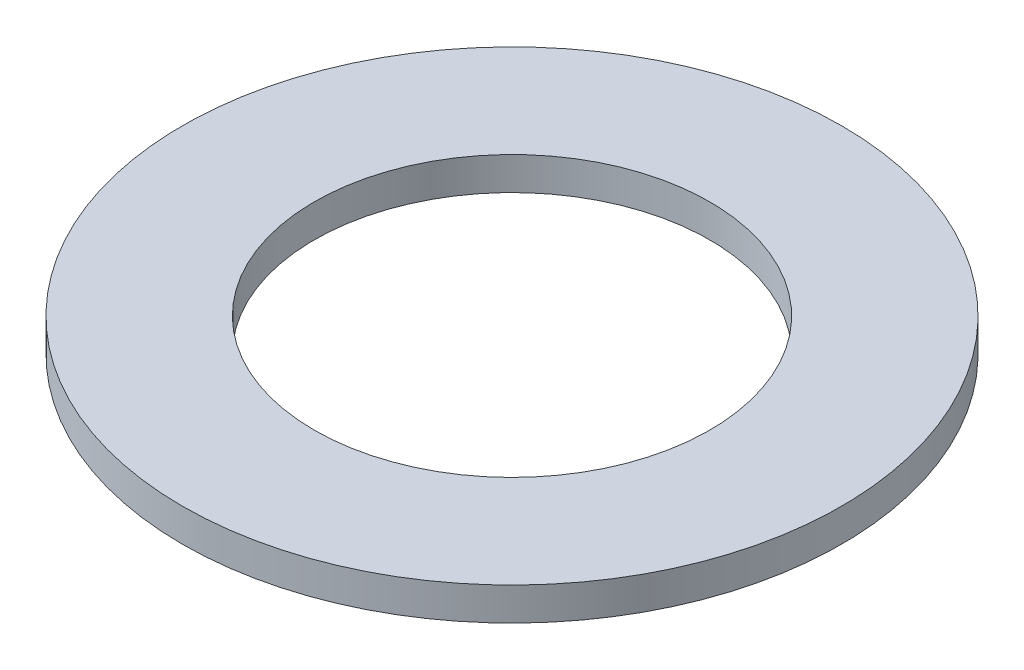
ISO-10303-21;
HEADER;
FILE_DESCRIPTION(('STEP AP214'),'2;1');
FILE_NAME('part.step','',(''),(''),'','','');
FILE_SCHEMA(('AUTOMOTIVE_DESIGN { 1 0 10303 214 1 1 1 1 }'));
ENDSEC;
DATA;
#1=APPLICATION_CONTEXT('core data for automotive mechanical design processes');
#2=APPLICATION_PROTOCOL_DEFINITION('international standard','automotive_design',2000,#1);
#3=PRODUCT_CONTEXT('',#1,'mechanical');
#4=PRODUCT('Part','Part','',(#3));
#5=PRODUCT_RELATED_PRODUCT_CATEGORY('part','',(#4));
#6=PRODUCT_DEFINITION_FORMATION('','',#4);
#7=PRODUCT_DEFINITION_CONTEXT('part definition',#1,'design');
#8=PRODUCT_DEFINITION('design','',#6,#7);
#9=PRODUCT_DEFINITION_SHAPE('','',#8);
#10=(LENGTH_UNIT() NAMED_UNIT(*) SI_UNIT(.MILLI.,.METRE.));
#11=(NAMED_UNIT(*) PLANE_ANGLE_UNIT() SI_UNIT($,.RADIAN.));
#12=(NAMED_UNIT(*) SI_UNIT($,.STERADIAN.) SOLID_ANGLE_UNIT());
#13=UNCERTAINTY_MEASURE_WITH_UNIT(LENGTH_MEASURE(1.E-05),#10,'distance_accuracy_value','');
#14=(GEOMETRIC_REPRESENTATION_CONTEXT(3) GLOBAL_UNCERTAINTY_ASSIGNED_CONTEXT((#13)) GLOBAL_UNIT_ASSIGNED_CONTEXT((#10,
#11,#12)) REPRESENTATION_CONTEXT('',''));
#15=CARTESIAN_POINT('',(0.,0.,0.));
#16=DIRECTION('',(0.,0.,1.));
#17=DIRECTION('',(1.,0.,0.));
#18=AXIS2_PLACEMENT_3D('',#15,#16,#17);
#19=CARTESIAN_POINT('',(0.,1.,0.));
#20=DIRECTION('',(0.,1.,0.));
#21=DIRECTION('',(0.,0.,1.));
#22=AXIS2_PLACEMENT_3D('',#19,#20,#21);
#23=PLANE('',#22);
#24=CARTESIAN_POINT('',(0.,1.,0.));
#25=DIRECTION('',(0.,1.,0.));
#26=DIRECTION('',(0.,0.,1.));
#27=AXIS2_PLACEMENT_3D('',#24,#25,#26);
#28=CIRCLE('',#27,10.);
#29=CARTESIAN_POINT('',(0.,1.,10.));
#30=VERTEX_POINT('',#29);
#31=EDGE_CURVE('E10',#30,#30,#28,.T.);
#32=ORIENTED_EDGE('',*,*,#31,.T.);
#33=EDGE_LOOP('',(#32));
#34=FACE_BOUND('',#33,.T.);
#35=CARTESIAN_POINT('',(0.,1.,0.));
#36=DIRECTION('',(0.,1.,0.));
#37=DIRECTION('',(0.,0.,1.));
#38=AXIS2_PLACEMENT_3D('',#35,#36,#37);
#39=CIRCLE('',#38,6.0005);
#40=CARTESIAN_POINT('',(0.,1.,6.0005));
#41=VERTEX_POINT('',#40);
#42=EDGE_CURVE('E50',#41,#41,#39,.T.);
#43=ORIENTED_EDGE('',*,*,#42,.F.);
#44=EDGE_LOOP('',(#43));
#45=FACE_BOUND('',#44,.T.);
#46=ADVANCED_FACE('F37',(#34,#45),#23,.T.);
#47=CARTESIAN_POINT('',(0.,0.,0.));
#48=DIRECTION('',(0.,1.,0.));
#49=DIRECTION('',(0.,0.,1.));
#50=AXIS2_PLACEMENT_3D('',#47,#48,#49);
#51=PLANE('',#50);
#52=CARTESIAN_POINT('',(0.,0.,0.));
#53=DIRECTION('',(0.,1.,0.));
#54=DIRECTION('',(0.,0.,1.));
#55=AXIS2_PLACEMENT_3D('',#52,#53,#54);
#56=CIRCLE('',#55,10.);
#57=CARTESIAN_POINT('',(0.,0.,10.));
#58=VERTEX_POINT('',#57);
#59=EDGE_CURVE('E41',#58,#58,#56,.T.);
#60=ORIENTED_EDGE('',*,*,#59,.F.);
#61=EDGE_LOOP('',(#60));
#62=FACE_BOUND('',#61,.T.);
#63=CARTESIAN_POINT('',(0.,0.,0.));
#64=DIRECTION('',(0.,1.,0.));
#65=DIRECTION('',(0.,0.,1.));
#66=AXIS2_PLACEMENT_3D('',#63,#64,#65);
#67=CIRCLE('',#66,6.0005);
#68=CARTESIAN_POINT('',(0.,0.,6.0005));
#69=VERTEX_POINT('',#68);
#70=EDGE_CURVE('E52',#69,#69,#67,.T.);
#71=ORIENTED_EDGE('',*,*,#70,.T.);
#72=EDGE_LOOP('',(#71));
#73=FACE_BOUND('',#72,.T.);
#74=ADVANCED_FACE('F64',(#62,#73),#51,.F.);
#75=CARTESIAN_POINT('',(0.,1.,0.));
#76=DIRECTION('',(0.,-1.,0.));
#77=DIRECTION('',(0.,0.,-1.));
#78=AXIS2_PLACEMENT_3D('',#75,#76,#77);
#79=CYLINDRICAL_SURFACE('',#78,10.);
#80=ORIENTED_EDGE('',*,*,#31,.F.);
#81=EDGE_LOOP('',(#80));
#82=FACE_BOUND('',#81,.T.);
#83=ORIENTED_EDGE('',*,*,#59,.T.);
#84=EDGE_LOOP('',(#83));
#85=FACE_BOUND('',#84,.T.);
#86=ADVANCED_FACE('F39',(#82,#85),#79,.T.);
#87=CARTESIAN_POINT('',(0.,1.,0.));
#88=DIRECTION('',(0.,-1.,0.));
#89=DIRECTION('',(0.,0.,-1.));
#90=AXIS2_PLACEMENT_3D('',#87,#88,#89);
#91=CYLINDRICAL_SURFACE('',#90,6.0005);
#92=ORIENTED_EDGE('',*,*,#42,.T.);
#93=EDGE_LOOP('',(#92));
#94=FACE_BOUND('',#93,.T.);
#95=ORIENTED_EDGE('',*,*,#70,.F.);
#96=EDGE_LOOP('',(#95));
#97=FACE_BOUND('',#96,.T.);
#98=ADVANCED_FACE('F60',(#94,#97),#91,.F.);
#99=CLOSED_SHELL('',(#46,#74,#86,#98));
#100=MANIFOLD_SOLID_BREP('B2',#99);
#101=ADVANCED_BREP_SHAPE_REPRESENTATION('',(#18,#100),#14);
#102=SHAPE_DEFINITION_REPRESENTATION(#9,#101);
ENDSEC;
END-ISO-10303-21;
